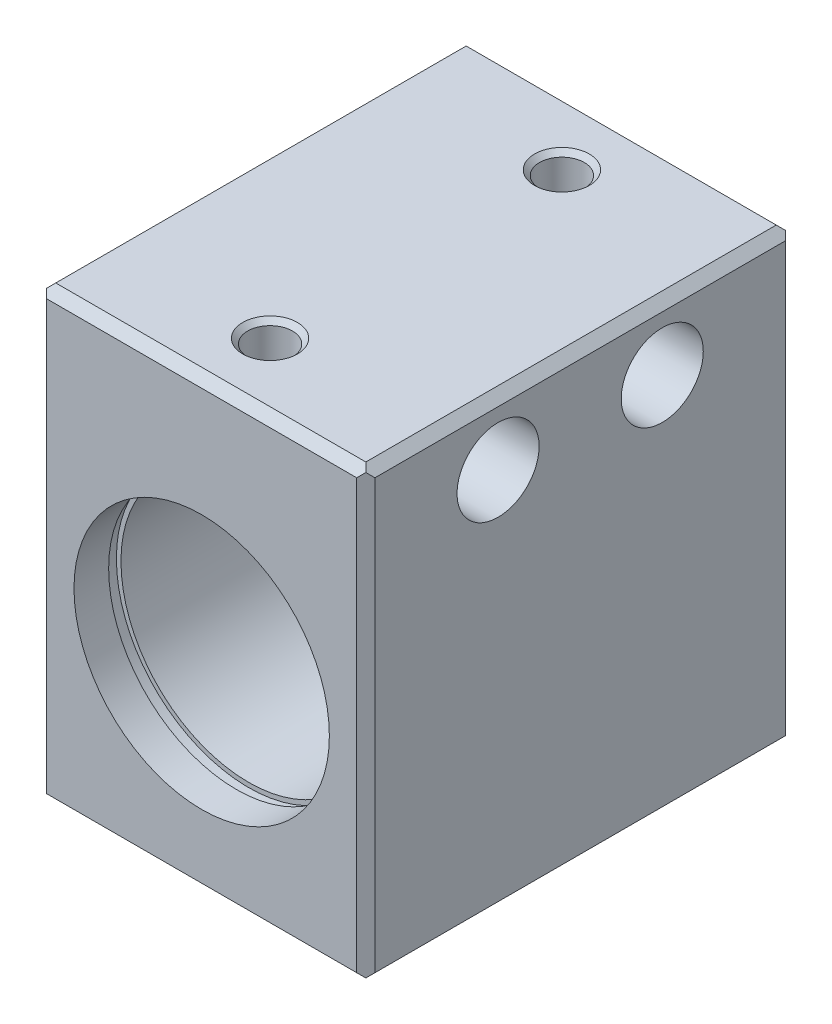
ISO-10303-21;
HEADER;
FILE_DESCRIPTION(('STEP AP214'),'2;1');
FILE_NAME('part.step','',(''),(''),'','','');
FILE_SCHEMA(('AUTOMOTIVE_DESIGN { 1 0 10303 214 1 1 1 1 }'));
ENDSEC;
DATA;
#1=APPLICATION_CONTEXT('core data for automotive mechanical design processes');
#2=APPLICATION_PROTOCOL_DEFINITION('international standard','automotive_design',2000,#1);
#3=PRODUCT_CONTEXT('',#1,'mechanical');
#4=PRODUCT('Part','Part','',(#3));
#5=PRODUCT_RELATED_PRODUCT_CATEGORY('part','',(#4));
#6=PRODUCT_DEFINITION_FORMATION('','',#4);
#7=PRODUCT_DEFINITION_CONTEXT('part definition',#1,'design');
#8=PRODUCT_DEFINITION('design','',#6,#7);
#9=PRODUCT_DEFINITION_SHAPE('','',#8);
#10=(LENGTH_UNIT() NAMED_UNIT(*) SI_UNIT(.MILLI.,.METRE.));
#11=(NAMED_UNIT(*) PLANE_ANGLE_UNIT() SI_UNIT($,.RADIAN.));
#12=(NAMED_UNIT(*) SI_UNIT($,.STERADIAN.) SOLID_ANGLE_UNIT());
#13=UNCERTAINTY_MEASURE_WITH_UNIT(LENGTH_MEASURE(1.E-05),#10,'distance_accuracy_value','');
#14=(GEOMETRIC_REPRESENTATION_CONTEXT(3) GLOBAL_UNCERTAINTY_ASSIGNED_CONTEXT((#13)) GLOBAL_UNIT_ASSIGNED_CONTEXT((#10,
#11,#12)) REPRESENTATION_CONTEXT('',''));
#15=CARTESIAN_POINT('',(0.,0.,0.));
#16=DIRECTION('',(0.,0.,1.));
#17=DIRECTION('',(1.,0.,0.));
#18=AXIS2_PLACEMENT_3D('',#15,#16,#17);
#19=CARTESIAN_POINT('',(0.,0.,0.));
#20=DIRECTION('',(0.,0.,-1.));
#21=DIRECTION('',(-1.,0.,0.));
#22=AXIS2_PLACEMENT_3D('',#19,#20,#21);
#23=CYLINDRICAL_SURFACE('',#22,14.);
#24=CARTESIAN_POINT('',(0.,0.,18.35));
#25=DIRECTION('',(0.,0.,-1.));
#26=DIRECTION('',(-1.,0.,0.));
#27=AXIS2_PLACEMENT_3D('',#24,#25,#26);
#28=CIRCLE('',#27,14.);
#29=CARTESIAN_POINT('',(-14.,0.,18.35));
#30=VERTEX_POINT('',#29);
#31=EDGE_CURVE('E20',#30,#30,#28,.F.);
#32=ORIENTED_EDGE('',*,*,#31,.T.);
#33=EDGE_LOOP('',(#32));
#34=FACE_BOUND('',#33,.T.);
#35=CARTESIAN_POINT('',(0.,0.,-18.35));
#36=DIRECTION('',(0.,0.,-1.));
#37=DIRECTION('',(-1.,0.,0.));
#38=AXIS2_PLACEMENT_3D('',#35,#36,#37);
#39=CIRCLE('',#38,14.);
#40=CARTESIAN_POINT('',(-14.,0.,-18.35));
#41=VERTEX_POINT('',#40);
#42=EDGE_CURVE('E395',#41,#41,#39,.T.);
#43=ORIENTED_EDGE('',*,*,#42,.T.);
#44=EDGE_LOOP('',(#43));
#45=FACE_BOUND('',#44,.T.);
#46=ADVANCED_FACE('F17',(#34,#45),#23,.F.);
#47=CARTESIAN_POINT('',(0.,14.25,18.35));
#48=DIRECTION('',(0.,0.,-1.));
#49=DIRECTION('',(-1.,0.,0.));
#50=AXIS2_PLACEMENT_3D('',#47,#48,#49);
#51=PLANE('',#50);
#52=ORIENTED_EDGE('',*,*,#31,.F.);
#53=EDGE_LOOP('',(#52));
#54=FACE_BOUND('',#53,.T.);
#55=CARTESIAN_POINT('',(0.,0.,18.35));
#56=DIRECTION('',(0.,0.,-1.));
#57=DIRECTION('',(-1.,0.,0.));
#58=AXIS2_PLACEMENT_3D('',#55,#56,#57);
#59=CIRCLE('',#58,14.5);
#60=CARTESIAN_POINT('',(-0.722303433468241,14.4819984031901,18.35));
#61=VERTEX_POINT('',#60);
#62=CARTESIAN_POINT('',(0.722303433468247,14.4819984031901,18.35));
#63=VERTEX_POINT('',#62);
#64=EDGE_CURVE('E155',#61,#63,#59,.F.);
#65=ORIENTED_EDGE('',*,*,#64,.T.);
#66=DIRECTION('',(0.,1.,0.));
#67=VECTOR('',#66,1.);
#68=CARTESIAN_POINT('',(0.722303433468244,14.25,18.35));
#69=LINE('',#68,#67);
#70=CARTESIAN_POINT('',(0.722303433468236,14.01,18.35));
#71=VERTEX_POINT('',#70);
#72=EDGE_CURVE('E162',#71,#63,#69,.T.);
#73=ORIENTED_EDGE('',*,*,#72,.F.);
#74=DIRECTION('',(1.,0.,0.));
#75=VECTOR('',#74,1.);
#76=CARTESIAN_POINT('',(0.,14.01,18.35));
#77=LINE('',#76,#75);
#78=CARTESIAN_POINT('',(-0.722303433468236,14.01,18.35));
#79=VERTEX_POINT('',#78);
#80=EDGE_CURVE('E158',#71,#79,#77,.F.);
#81=ORIENTED_EDGE('',*,*,#80,.T.);
#82=DIRECTION('',(0.,1.,0.));
#83=VECTOR('',#82,1.);
#84=CARTESIAN_POINT('',(-0.722303433468244,14.25,18.35));
#85=LINE('',#84,#83);
#86=EDGE_CURVE('E151',#61,#79,#85,.F.);
#87=ORIENTED_EDGE('',*,*,#86,.F.);
#88=EDGE_LOOP('',(#65,#73,#81,#87));
#89=FACE_BOUND('',#88,.T.);
#90=ADVANCED_FACE('F153',(#54,#89),#51,.F.);
#91=CARTESIAN_POINT('',(0.,14.25,-18.35));
#92=DIRECTION('',(0.,0.,1.));
#93=DIRECTION('',(1.,0.,0.));
#94=AXIS2_PLACEMENT_3D('',#91,#92,#93);
#95=PLANE('',#94);
#96=ORIENTED_EDGE('',*,*,#42,.F.);
#97=EDGE_LOOP('',(#96));
#98=FACE_BOUND('',#97,.T.);
#99=DIRECTION('',(1.,0.,0.));
#100=VECTOR('',#99,1.);
#101=CARTESIAN_POINT('',(0.,14.01,-18.35));
#102=LINE('',#101,#100);
#103=CARTESIAN_POINT('',(-0.722303433468236,14.01,-18.35));
#104=VERTEX_POINT('',#103);
#105=CARTESIAN_POINT('',(0.722303433468229,14.01,-18.35));
#106=VERTEX_POINT('',#105);
#107=EDGE_CURVE('E169',#104,#106,#102,.T.);
#108=ORIENTED_EDGE('',*,*,#107,.T.);
#109=DIRECTION('',(0.,1.,0.));
#110=VECTOR('',#109,1.);
#111=CARTESIAN_POINT('',(0.722303433468229,14.25,-18.35));
#112=LINE('',#111,#110);
#113=CARTESIAN_POINT('',(0.722303433468228,14.4819984031901,-18.35));
#114=VERTEX_POINT('',#113);
#115=EDGE_CURVE('E388',#114,#106,#112,.F.);
#116=ORIENTED_EDGE('',*,*,#115,.F.);
#117=CARTESIAN_POINT('',(0.,0.,-18.35));
#118=DIRECTION('',(0.,0.,-1.));
#119=DIRECTION('',(-1.,0.,0.));
#120=AXIS2_PLACEMENT_3D('',#117,#118,#119);
#121=CIRCLE('',#120,14.5);
#122=CARTESIAN_POINT('',(-0.722303433468254,14.4819984031901,-18.35));
#123=VERTEX_POINT('',#122);
#124=EDGE_CURVE('E168',#114,#123,#121,.T.);
#125=ORIENTED_EDGE('',*,*,#124,.T.);
#126=DIRECTION('',(0.,1.,0.));
#127=VECTOR('',#126,1.);
#128=CARTESIAN_POINT('',(-0.722303433468244,14.25,-18.35));
#129=LINE('',#128,#127);
#130=EDGE_CURVE('E391',#104,#123,#129,.T.);
#131=ORIENTED_EDGE('',*,*,#130,.F.);
#132=EDGE_LOOP('',(#108,#116,#125,#131));
#133=FACE_BOUND('',#132,.T.);
#134=ADVANCED_FACE('F393',(#98,#133),#95,.F.);
#135=CARTESIAN_POINT('',(0.,14.01,14.77075));
#136=DIRECTION('',(0.,-1.,0.));
#137=DIRECTION('',(0.,0.,-1.));
#138=AXIS2_PLACEMENT_3D('',#135,#136,#137);
#139=PLANE('',#138);
#140=ORIENTED_EDGE('',*,*,#80,.F.);
#141=CARTESIAN_POINT('',(0.,14.01,16.));
#142=DIRECTION('',(0.,-1.,0.));
#143=DIRECTION('',(0.,0.,-1.));
#144=AXIS2_PLACEMENT_3D('',#141,#142,#143);
#145=CIRCLE('',#144,2.4585);
#146=EDGE_CURVE('E173',#71,#79,#145,.F.);
#147=ORIENTED_EDGE('',*,*,#146,.T.);
#148=EDGE_LOOP('',(#140,#147));
#149=FACE_BOUND('',#148,.T.);
#150=ADVANCED_FACE('F613',(#149),#139,.F.);
#151=CARTESIAN_POINT('',(0.,14.01,-17.22925));
#152=DIRECTION('',(0.,-1.,0.));
#153=DIRECTION('',(0.,0.,-1.));
#154=AXIS2_PLACEMENT_3D('',#151,#152,#153);
#155=PLANE('',#154);
#156=CARTESIAN_POINT('',(0.,14.01,-16.));
#157=DIRECTION('',(0.,-1.,0.));
#158=DIRECTION('',(0.,0.,-1.));
#159=AXIS2_PLACEMENT_3D('',#156,#157,#158);
#160=CIRCLE('',#159,2.4585);
#161=EDGE_CURVE('E176',#104,#106,#160,.F.);
#162=ORIENTED_EDGE('',*,*,#161,.T.);
#163=ORIENTED_EDGE('',*,*,#107,.F.);
#164=EDGE_LOOP('',(#162,#163));
#165=FACE_BOUND('',#164,.T.);
#166=ADVANCED_FACE('F215',(#165),#155,.F.);
#167=CARTESIAN_POINT('',(0.,0.,19.025));
#168=DIRECTION('',(0.,0.,-1.));
#169=DIRECTION('',(-1.,0.,0.));
#170=AXIS2_PLACEMENT_3D('',#167,#168,#169);
#171=CYLINDRICAL_SURFACE('',#170,14.5);
#172=CARTESIAN_POINT('',(0.,0.,19.7));
#173=DIRECTION('',(0.,0.,-1.));
#174=DIRECTION('',(-1.,0.,0.));
#175=AXIS2_PLACEMENT_3D('',#172,#173,#174);
#176=CIRCLE('',#175,14.5);
#177=CARTESIAN_POINT('',(-14.5,0.,19.7));
#178=VERTEX_POINT('',#177);
#179=EDGE_CURVE('E347',#178,#178,#176,.F.);
#180=ORIENTED_EDGE('',*,*,#179,.T.);
#181=EDGE_LOOP('',(#180));
#182=FACE_BOUND('',#181,.T.);
#183=CARTESIAN_POINT('',(-0.72230343346824,14.4819984031901,18.35));
#184=CARTESIAN_POINT('',(-0.663277259254931,14.4849440582216,18.3681433250117));
#185=CARTESIAN_POINT('',(-0.603571473846199,14.4875581640115,18.3840588889899));
#186=CARTESIAN_POINT('',(-0.483107659711919,14.4920748298896,18.4113574079169));
#187=CARTESIAN_POINT('',(-0.422349654420086,14.4939774058028,18.4227404636727));
#188=CARTESIAN_POINT('',(-0.241763705776894,14.4984753583928,18.4495590074876));
#189=CARTESIAN_POINT('',(-0.120881852888447,14.5,18.4585));
#190=CARTESIAN_POINT('',(0.120881852888448,14.5,18.4585));
#191=CARTESIAN_POINT('',(0.241763705776897,14.4984753583928,18.4495590074876));
#192=CARTESIAN_POINT('',(0.422349654420091,14.4939774058028,18.4227404636727));
#193=CARTESIAN_POINT('',(0.483107659711924,14.4920748298896,18.4113574079169));
#194=CARTESIAN_POINT('',(0.603571473846205,14.4875581640115,18.3840588889899));
#195=CARTESIAN_POINT('',(0.663277259254938,14.4849440582216,18.3681433250117));
#196=CARTESIAN_POINT('',(0.722303433468248,14.4819984031901,18.35));
#197=B_SPLINE_CURVE_WITH_KNOTS('',3,(#183,#184,#185,#186,#187,#188,#189,#190,#191,#192,#193,
#194,#195,#196),.UNSPECIFIED.,.F.,.F.,(4,2,2,2,2,2,4),(0.,0.185379368417201,0.370754613594466,
0.732984293577592,1.09521397356072,1.28058921873799,1.46596858715519),.UNSPECIFIED.);
#198=EDGE_CURVE('E166',#61,#63,#197,.T.);
#199=ORIENTED_EDGE('',*,*,#198,.T.);
#200=ORIENTED_EDGE('',*,*,#64,.F.);
#201=EDGE_LOOP('',(#199,#200));
#202=FACE_BOUND('',#201,.T.);
#203=ADVANCED_FACE('F165',(#182,#202),#171,.F.);
#204=CARTESIAN_POINT('',(0.,0.,-19.025));
#205=DIRECTION('',(0.,0.,-1.));
#206=DIRECTION('',(-1.,0.,0.));
#207=AXIS2_PLACEMENT_3D('',#204,#205,#206);
#208=CYLINDRICAL_SURFACE('',#207,14.5);
#209=ORIENTED_EDGE('',*,*,#124,.F.);
#210=CARTESIAN_POINT('',(0.722303433468228,14.4819984031901,-18.35));
#211=CARTESIAN_POINT('',(0.663277259254919,14.4849440582216,-18.3681433250117));
#212=CARTESIAN_POINT('',(0.603571473846187,14.4875581640115,-18.3840588889899));
#213=CARTESIAN_POINT('',(0.48310765971191,14.4920748298896,-18.4113574079169));
#214=CARTESIAN_POINT('',(0.422349654420078,14.4939774058028,-18.4227404636727));
#215=CARTESIAN_POINT('',(0.24176370577689,14.4984753583928,-18.4495590074876));
#216=CARTESIAN_POINT('',(0.120881852888444,14.5,-18.4585));
#217=CARTESIAN_POINT('',(-0.12088185288845,14.5,-18.4585));
#218=CARTESIAN_POINT('',(-0.2417637057769,14.4984753583928,-18.4495590074876));
#219=CARTESIAN_POINT('',(-0.422349654420095,14.4939774058028,-18.4227404636727));
#220=CARTESIAN_POINT('',(-0.483107659711929,14.4920748298896,-18.4113574079169));
#221=CARTESIAN_POINT('',(-0.60357147384621,14.4875581640115,-18.3840588889899));
#222=CARTESIAN_POINT('',(-0.663277259254943,14.4849440582216,-18.3681433250117));
#223=CARTESIAN_POINT('',(-0.722303433468254,14.4819984031901,-18.35));
#224=B_SPLINE_CURVE_WITH_KNOTS('',3,(#210,#211,#212,#213,#214,#215,#216,#217,#218,#219,#220,
#221,#222,#223),.UNSPECIFIED.,.F.,.F.,(4,2,2,2,2,2,4),(0.,0.185379368417198,0.37075461359446,
0.732984293577581,1.09521397356071,1.28058921873798,1.46596858715519),.UNSPECIFIED.);
#225=EDGE_CURVE('E172',#114,#123,#224,.T.);
#226=ORIENTED_EDGE('',*,*,#225,.T.);
#227=EDGE_LOOP('',(#209,#226));
#228=FACE_BOUND('',#227,.T.);
#229=CARTESIAN_POINT('',(0.,0.,-19.7));
#230=DIRECTION('',(0.,0.,-1.));
#231=DIRECTION('',(-1.,0.,0.));
#232=AXIS2_PLACEMENT_3D('',#229,#230,#231);
#233=CIRCLE('',#232,14.5);
#234=CARTESIAN_POINT('',(-14.5,0.,-19.7));
#235=VERTEX_POINT('',#234);
#236=EDGE_CURVE('E377',#235,#235,#233,.T.);
#237=ORIENTED_EDGE('',*,*,#236,.T.);
#238=EDGE_LOOP('',(#237));
#239=FACE_BOUND('',#238,.T.);
#240=ADVANCED_FACE('F206',(#228,#239),#208,.F.);
#241=CARTESIAN_POINT('',(14.5,20.,-9.));
#242=DIRECTION('',(1.,0.,0.));
#243=DIRECTION('',(0.,0.,-1.));
#244=AXIS2_PLACEMENT_3D('',#241,#242,#243);
#245=CYLINDRICAL_SURFACE('',#244,4.5);
#246=CARTESIAN_POINT('',(11.,20.,-9.));
#247=DIRECTION('',(1.,0.,0.));
#248=DIRECTION('',(0.,0.,-1.));
#249=AXIS2_PLACEMENT_3D('',#246,#247,#248);
#250=CIRCLE('',#249,4.5);
#251=CARTESIAN_POINT('',(11.,20.,-13.5));
#252=VERTEX_POINT('',#251);
#253=EDGE_CURVE('E368',#252,#252,#250,.F.);
#254=ORIENTED_EDGE('',*,*,#253,.T.);
#255=EDGE_LOOP('',(#254));
#256=FACE_BOUND('',#255,.T.);
#257=CARTESIAN_POINT('',(18.,20.,-9.));
#258=DIRECTION('',(1.,0.,0.));
#259=DIRECTION('',(0.,0.,-1.));
#260=AXIS2_PLACEMENT_3D('',#257,#258,#259);
#261=CIRCLE('',#260,4.5);
#262=CARTESIAN_POINT('',(18.,20.,-13.5));
#263=VERTEX_POINT('',#262);
#264=EDGE_CURVE('E374',#263,#263,#261,.F.);
#265=ORIENTED_EDGE('',*,*,#264,.F.);
#266=EDGE_LOOP('',(#265));
#267=FACE_BOUND('',#266,.T.);
#268=ADVANCED_FACE('F203',(#256,#267),#245,.F.);
#269=CARTESIAN_POINT('',(14.5,20.,9.));
#270=DIRECTION('',(1.,0.,0.));
#271=DIRECTION('',(0.,0.,-1.));
#272=AXIS2_PLACEMENT_3D('',#269,#270,#271);
#273=CYLINDRICAL_SURFACE('',#272,4.5);
#274=CARTESIAN_POINT('',(11.,20.,9.));
#275=DIRECTION('',(1.,0.,0.));
#276=DIRECTION('',(0.,0.,-1.));
#277=AXIS2_PLACEMENT_3D('',#274,#275,#276);
#278=CIRCLE('',#277,4.5);
#279=CARTESIAN_POINT('',(11.,20.,4.5));
#280=VERTEX_POINT('',#279);
#281=EDGE_CURVE('E364',#280,#280,#278,.F.);
#282=ORIENTED_EDGE('',*,*,#281,.T.);
#283=EDGE_LOOP('',(#282));
#284=FACE_BOUND('',#283,.T.);
#285=CARTESIAN_POINT('',(18.,20.,9.));
#286=DIRECTION('',(1.,0.,0.));
#287=DIRECTION('',(0.,0.,-1.));
#288=AXIS2_PLACEMENT_3D('',#285,#286,#287);
#289=CIRCLE('',#288,4.5);
#290=CARTESIAN_POINT('',(18.,20.,4.5));
#291=VERTEX_POINT('',#290);
#292=EDGE_CURVE('E371',#291,#291,#289,.F.);
#293=ORIENTED_EDGE('',*,*,#292,.F.);
#294=EDGE_LOOP('',(#293));
#295=FACE_BOUND('',#294,.T.);
#296=ADVANCED_FACE('F197',(#284,#295),#273,.F.);
#297=CARTESIAN_POINT('',(0.,20.23425,16.));
#298=DIRECTION('',(0.,-1.,0.));
#299=DIRECTION('',(0.,0.,-1.));
#300=AXIS2_PLACEMENT_3D('',#297,#298,#299);
#301=CYLINDRICAL_SURFACE('',#300,2.4585);
#302=CARTESIAN_POINT('',(0.,26.4584999999897,16.));
#303=DIRECTION('',(0.,1.,0.));
#304=DIRECTION('',(0.,0.,-1.));
#305=AXIS2_PLACEMENT_3D('',#302,#303,#304);
#306=CIRCLE('',#305,2.45849999996926);
#307=CARTESIAN_POINT('',(0.,26.4584999999897,13.5415000000307));
#308=VERTEX_POINT('',#307);
#309=EDGE_CURVE('E398',#308,#308,#306,.T.);
#310=ORIENTED_EDGE('',*,*,#309,.T.);
#311=EDGE_LOOP('',(#310));
#312=FACE_BOUND('',#311,.T.);
#313=ORIENTED_EDGE('',*,*,#72,.T.);
#314=ORIENTED_EDGE('',*,*,#198,.F.);
#315=ORIENTED_EDGE('',*,*,#86,.T.);
#316=ORIENTED_EDGE('',*,*,#146,.F.);
#317=EDGE_LOOP('',(#313,#314,#315,#316));
#318=FACE_BOUND('',#317,.T.);
#319=ADVANCED_FACE('F171',(#312,#318),#301,.F.);
#320=CARTESIAN_POINT('',(0.,20.23425,-16.));
#321=DIRECTION('',(0.,-1.,0.));
#322=DIRECTION('',(0.,0.,-1.));
#323=AXIS2_PLACEMENT_3D('',#320,#321,#322);
#324=CYLINDRICAL_SURFACE('',#323,2.4585);
#325=CARTESIAN_POINT('',(0.,26.4584999999897,-16.));
#326=DIRECTION('',(0.,1.,0.));
#327=DIRECTION('',(0.,0.,-1.));
#328=AXIS2_PLACEMENT_3D('',#325,#326,#327);
#329=CIRCLE('',#328,2.45849999995153);
#330=CARTESIAN_POINT('',(0.,26.4584999999897,-18.4584999999515));
#331=VERTEX_POINT('',#330);
#332=EDGE_CURVE('E490',#331,#331,#329,.T.);
#333=ORIENTED_EDGE('',*,*,#332,.T.);
#334=EDGE_LOOP('',(#333));
#335=FACE_BOUND('',#334,.T.);
#336=ORIENTED_EDGE('',*,*,#115,.T.);
#337=ORIENTED_EDGE('',*,*,#161,.F.);
#338=ORIENTED_EDGE('',*,*,#130,.T.);
#339=ORIENTED_EDGE('',*,*,#225,.F.);
#340=EDGE_LOOP('',(#336,#337,#338,#339));
#341=FACE_BOUND('',#340,.T.);
#342=ADVANCED_FACE('F196',(#335,#341),#324,.F.);
#343=CARTESIAN_POINT('',(0.,14.25,19.7));
#344=DIRECTION('',(0.,0.,1.));
#345=DIRECTION('',(1.,0.,0.));
#346=AXIS2_PLACEMENT_3D('',#343,#344,#345);
#347=PLANE('',#346);
#348=ORIENTED_EDGE('',*,*,#179,.F.);
#349=EDGE_LOOP('',(#348));
#350=FACE_BOUND('',#349,.T.);
#351=CARTESIAN_POINT('',(0.,0.,19.7));
#352=DIRECTION('',(0.,0.,-1.));
#353=DIRECTION('',(-1.,0.,0.));
#354=AXIS2_PLACEMENT_3D('',#351,#352,#353);
#355=CIRCLE('',#354,14.);
#356=CARTESIAN_POINT('',(-14.,0.,19.7));
#357=VERTEX_POINT('',#356);
#358=EDGE_CURVE('E350',#357,#357,#355,.F.);
#359=ORIENTED_EDGE('',*,*,#358,.T.);
#360=EDGE_LOOP('',(#359));
#361=FACE_BOUND('',#360,.T.);
#362=ADVANCED_FACE('F336',(#350,#361),#347,.F.);
#363=CARTESIAN_POINT('',(0.,14.25,-19.7));
#364=DIRECTION('',(0.,0.,-1.));
#365=DIRECTION('',(-1.,0.,0.));
#366=AXIS2_PLACEMENT_3D('',#363,#364,#365);
#367=PLANE('',#366);
#368=CARTESIAN_POINT('',(0.,0.,-19.7));
#369=DIRECTION('',(0.,0.,-1.));
#370=DIRECTION('',(-1.,0.,0.));
#371=AXIS2_PLACEMENT_3D('',#368,#369,#370);
#372=CIRCLE('',#371,14.);
#373=CARTESIAN_POINT('',(-14.,0.,-19.7));
#374=VERTEX_POINT('',#373);
#375=EDGE_CURVE('E362',#374,#374,#372,.T.);
#376=ORIENTED_EDGE('',*,*,#375,.T.);
#377=EDGE_LOOP('',(#376));
#378=FACE_BOUND('',#377,.T.);
#379=ORIENTED_EDGE('',*,*,#236,.F.);
#380=EDGE_LOOP('',(#379));
#381=FACE_BOUND('',#380,.T.);
#382=ADVANCED_FACE('F333',(#378,#381),#367,.F.);
#383=CARTESIAN_POINT('',(18.,0.,0.));
#384=DIRECTION('',(1.,0.,0.));
#385=DIRECTION('',(0.,0.,-1.));
#386=AXIS2_PLACEMENT_3D('',#383,#384,#385);
#387=PLANE('',#386);
#388=ORIENTED_EDGE('',*,*,#292,.T.);
#389=EDGE_LOOP('',(#388));
#390=FACE_BOUND('',#389,.T.);
#391=ORIENTED_EDGE('',*,*,#264,.T.);
#392=EDGE_LOOP('',(#391));
#393=FACE_BOUND('',#392,.T.);
#394=DIRECTION('',(0.,1.,0.));
#395=VECTOR('',#394,1.);
#396=CARTESIAN_POINT('',(18.,49.,22.5));
#397=LINE('',#396,#395);
#398=CARTESIAN_POINT('',(18.,26.,22.5));
#399=VERTEX_POINT('',#398);
#400=CARTESIAN_POINT('',(18.,-21.,22.5));
#401=VERTEX_POINT('',#400);
#402=EDGE_CURVE('E488',#399,#401,#397,.F.);
#403=ORIENTED_EDGE('',*,*,#402,.T.);
#404=DIRECTION('',(0.,0.,1.));
#405=VECTOR('',#404,1.);
#406=CARTESIAN_POINT('',(18.,-21.,23.5));
#407=LINE('',#406,#405);
#408=CARTESIAN_POINT('',(18.,-21.,-22.5));
#409=VERTEX_POINT('',#408);
#410=EDGE_CURVE('E356',#401,#409,#407,.F.);
#411=ORIENTED_EDGE('',*,*,#410,.T.);
#412=DIRECTION('',(0.,1.,0.));
#413=VECTOR('',#412,1.);
#414=CARTESIAN_POINT('',(18.,49.,-22.5));
#415=LINE('',#414,#413);
#416=CARTESIAN_POINT('',(18.,26.,-22.5));
#417=VERTEX_POINT('',#416);
#418=EDGE_CURVE('E463',#409,#417,#415,.T.);
#419=ORIENTED_EDGE('',*,*,#418,.T.);
#420=DIRECTION('',(0.,0.,1.));
#421=VECTOR('',#420,1.);
#422=CARTESIAN_POINT('',(18.,26.,23.5));
#423=LINE('',#422,#421);
#424=EDGE_CURVE('E367',#417,#399,#423,.T.);
#425=ORIENTED_EDGE('',*,*,#424,.T.);
#426=EDGE_LOOP('',(#403,#411,#419,#425));
#427=FACE_BOUND('',#426,.T.);
#428=ADVANCED_FACE('F329',(#390,#393,#427),#387,.T.);
#429=CARTESIAN_POINT('',(11.,22.25,-9.));
#430=DIRECTION('',(-1.,0.,0.));
#431=DIRECTION('',(0.,0.,1.));
#432=AXIS2_PLACEMENT_3D('',#429,#430,#431);
#433=PLANE('',#432);
#434=ORIENTED_EDGE('',*,*,#253,.F.);
#435=EDGE_LOOP('',(#434));
#436=FACE_BOUND('',#435,.T.);
#437=CARTESIAN_POINT('',(10.9999999999673,20.,-9.));
#438=DIRECTION('',(1.,0.,0.));
#439=DIRECTION('',(0.,0.,-1.));
#440=AXIS2_PLACEMENT_3D('',#437,#438,#439);
#441=CIRCLE('',#440,2.99999999996771);
#442=CARTESIAN_POINT('',(10.9999999999673,20.,-11.9999999999677));
#443=VERTEX_POINT('',#442);
#444=EDGE_CURVE('E432',#443,#443,#441,.F.);
#445=ORIENTED_EDGE('',*,*,#444,.T.);
#446=EDGE_LOOP('',(#445));
#447=FACE_BOUND('',#446,.T.);
#448=ADVANCED_FACE('F325',(#436,#447),#433,.F.);
#449=CARTESIAN_POINT('',(11.,22.25,9.));
#450=DIRECTION('',(-1.,0.,0.));
#451=DIRECTION('',(0.,0.,1.));
#452=AXIS2_PLACEMENT_3D('',#449,#450,#451);
#453=PLANE('',#452);
#454=ORIENTED_EDGE('',*,*,#281,.F.);
#455=EDGE_LOOP('',(#454));
#456=FACE_BOUND('',#455,.T.);
#457=CARTESIAN_POINT('',(10.9999999999673,20.,9.));
#458=DIRECTION('',(1.,0.,0.));
#459=DIRECTION('',(0.,0.,-1.));
#460=AXIS2_PLACEMENT_3D('',#457,#458,#459);
#461=CIRCLE('',#460,2.99999999996771);
#462=CARTESIAN_POINT('',(10.9999999999673,20.,6.00000000003229));
#463=VERTEX_POINT('',#462);
#464=EDGE_CURVE('E429',#463,#463,#461,.F.);
#465=ORIENTED_EDGE('',*,*,#464,.T.);
#466=EDGE_LOOP('',(#465));
#467=FACE_BOUND('',#466,.T.);
#468=ADVANCED_FACE('F321',(#456,#467),#453,.F.);
#469=CARTESIAN_POINT('',(17.,27.,23.5));
#470=DIRECTION('',(-0.707106781186548,-0.707106781186548,0.));
#471=DIRECTION('',(0.707106781186548,-0.707106781186548,0.));
#472=AXIS2_PLACEMENT_3D('',#469,#470,#471);
#473=PLANE('',#472);
#474=DIRECTION('',(0.577350269189626,-0.577350269189626,-0.577350269189626));
#475=VECTOR('',#474,1.);
#476=CARTESIAN_POINT('',(17.,27.,-22.5));
#477=LINE('',#476,#475);
#478=CARTESIAN_POINT('',(17.,27.,-22.5));
#479=VERTEX_POINT('',#478);
#480=CARTESIAN_POINT('',(17.5,26.5,-23.));
#481=VERTEX_POINT('',#480);
#482=EDGE_CURVE('E434',#479,#481,#477,.T.);
#483=ORIENTED_EDGE('',*,*,#482,.F.);
#484=DIRECTION('',(0.,0.,1.));
#485=VECTOR('',#484,1.);
#486=CARTESIAN_POINT('',(17.,27.,-22.5));
#487=LINE('',#486,#485);
#488=CARTESIAN_POINT('',(17.,27.,22.5));
#489=VERTEX_POINT('',#488);
#490=EDGE_CURVE('E523',#489,#479,#487,.F.);
#491=ORIENTED_EDGE('',*,*,#490,.F.);
#492=DIRECTION('',(-0.577350269189626,0.577350269189626,-0.577350269189626));
#493=VECTOR('',#492,1.);
#494=CARTESIAN_POINT('',(17.5,26.5,23.));
#495=LINE('',#494,#493);
#496=CARTESIAN_POINT('',(17.5,26.5,23.));
#497=VERTEX_POINT('',#496);
#498=EDGE_CURVE('E480',#497,#489,#495,.T.);
#499=ORIENTED_EDGE('',*,*,#498,.F.);
#500=DIRECTION('',(0.577350269189627,-0.577350269189623,-0.577350269189627));
#501=VECTOR('',#500,1.);
#502=CARTESIAN_POINT('',(17.5,26.5,23.));
#503=LINE('',#502,#501);
#504=EDGE_CURVE('E485',#497,#399,#503,.T.);
#505=ORIENTED_EDGE('',*,*,#504,.T.);
#506=ORIENTED_EDGE('',*,*,#424,.F.);
#507=DIRECTION('',(-0.577350269189627,0.577350269189623,-0.577350269189627));
#508=VECTOR('',#507,1.);
#509=CARTESIAN_POINT('',(18.,26.,-22.5));
#510=LINE('',#509,#508);
#511=EDGE_CURVE('E461',#417,#481,#510,.T.);
#512=ORIENTED_EDGE('',*,*,#511,.T.);
#513=EDGE_LOOP('',(#483,#491,#499,#505,#506,#512));
#514=FACE_BOUND('',#513,.T.);
#515=ADVANCED_FACE('F317',(#514),#473,.F.);
#516=CARTESIAN_POINT('',(0.,27.0000000000437,16.));
#517=DIRECTION('',(0.,1.,0.));
#518=DIRECTION('',(0.,0.,1.));
#519=AXIS2_PLACEMENT_3D('',#516,#517,#518);
#520=CONICAL_SURFACE('',#519,3.00000000002319,0.785398163397448);
#521=CARTESIAN_POINT('',(0.,27.0000000000437,16.));
#522=DIRECTION('',(0.,1.,0.));
#523=DIRECTION('',(0.,0.,1.));
#524=AXIS2_PLACEMENT_3D('',#521,#522,#523);
#525=CIRCLE('',#524,3.00000000002319);
#526=CARTESIAN_POINT('',(0.,27.0000000000437,19.0000000000232));
#527=VERTEX_POINT('',#526);
#528=EDGE_CURVE('E425',#527,#527,#525,.F.);
#529=ORIENTED_EDGE('',*,*,#528,.F.);
#530=EDGE_LOOP('',(#529));
#531=FACE_BOUND('',#530,.T.);
#532=ORIENTED_EDGE('',*,*,#309,.F.);
#533=EDGE_LOOP('',(#532));
#534=FACE_BOUND('',#533,.T.);
#535=ADVANCED_FACE('F313',(#531,#534),#520,.F.);
#536=CARTESIAN_POINT('',(0.,27.0000000000437,-16.));
#537=DIRECTION('',(0.,1.,0.));
#538=DIRECTION('',(0.,0.,1.));
#539=AXIS2_PLACEMENT_3D('',#536,#537,#538);
#540=CONICAL_SURFACE('',#539,3.00000000000546,0.785398163397448);
#541=CARTESIAN_POINT('',(0.,27.0000000000437,-16.));
#542=DIRECTION('',(0.,1.,0.));
#543=DIRECTION('',(0.,0.,1.));
#544=AXIS2_PLACEMENT_3D('',#541,#542,#543);
#545=CIRCLE('',#544,3.00000000000546);
#546=CARTESIAN_POINT('',(0.,27.0000000000437,-12.9999999999945));
#547=VERTEX_POINT('',#546);
#548=EDGE_CURVE('E421',#547,#547,#545,.F.);
#549=ORIENTED_EDGE('',*,*,#548,.F.);
#550=EDGE_LOOP('',(#549));
#551=FACE_BOUND('',#550,.T.);
#552=ORIENTED_EDGE('',*,*,#332,.F.);
#553=EDGE_LOOP('',(#552));
#554=FACE_BOUND('',#553,.T.);
#555=ADVANCED_FACE('F309',(#551,#554),#540,.F.);
#556=CARTESIAN_POINT('',(18.,49.,22.5));
#557=DIRECTION('',(-0.707106781186548,0.,-0.707106781186548));
#558=DIRECTION('',(-0.707106781186548,0.,0.707106781186548));
#559=AXIS2_PLACEMENT_3D('',#556,#557,#558);
#560=PLANE('',#559);
#561=DIRECTION('',(0.577350269189626,0.577350269189626,-0.577350269189626));
#562=VECTOR('',#561,1.);
#563=CARTESIAN_POINT('',(17.,26.,23.5));
#564=LINE('',#563,#562);
#565=CARTESIAN_POINT('',(17.,26.,23.5));
#566=VERTEX_POINT('',#565);
#567=EDGE_CURVE('E482',#566,#497,#564,.T.);
#568=ORIENTED_EDGE('',*,*,#567,.F.);
#569=DIRECTION('',(0.,1.,0.));
#570=VECTOR('',#569,1.);
#571=CARTESIAN_POINT('',(17.,26.,23.5));
#572=LINE('',#571,#570);
#573=CARTESIAN_POINT('',(17.,-21.,23.5));
#574=VERTEX_POINT('',#573);
#575=EDGE_CURVE('E424',#574,#566,#572,.T.);
#576=ORIENTED_EDGE('',*,*,#575,.F.);
#577=DIRECTION('',(-0.577350269189626,0.577350269189626,0.577350269189626));
#578=VECTOR('',#577,1.);
#579=CARTESIAN_POINT('',(17.5,-21.5,23.));
#580=LINE('',#579,#578);
#581=CARTESIAN_POINT('',(17.5,-21.5,23.));
#582=VERTEX_POINT('',#581);
#583=EDGE_CURVE('E476',#582,#574,#580,.T.);
#584=ORIENTED_EDGE('',*,*,#583,.F.);
#585=DIRECTION('',(0.577350269189626,0.577350269189626,-0.577350269189626));
#586=VECTOR('',#585,1.);
#587=CARTESIAN_POINT('',(17.5,-21.5,23.));
#588=LINE('',#587,#586);
#589=EDGE_CURVE('E352',#582,#401,#588,.T.);
#590=ORIENTED_EDGE('',*,*,#589,.T.);
#591=ORIENTED_EDGE('',*,*,#402,.F.);
#592=ORIENTED_EDGE('',*,*,#504,.F.);
#593=EDGE_LOOP('',(#568,#576,#584,#590,#591,#592));
#594=FACE_BOUND('',#593,.T.);
#595=ADVANCED_FACE('F305',(#594),#560,.F.);
#596=CARTESIAN_POINT('',(18.,27.,22.5));
#597=DIRECTION('',(0.,0.707106781186548,0.707106781186548));
#598=DIRECTION('',(0.,-0.707106781186548,0.707106781186548));
#599=AXIS2_PLACEMENT_3D('',#596,#597,#598);
#600=PLANE('',#599);
#601=DIRECTION('',(0.577350269189626,-0.577350269189626,0.577350269189626));
#602=VECTOR('',#601,1.);
#603=CARTESIAN_POINT('',(-17.5,26.5,23.));
#604=LINE('',#603,#602);
#605=CARTESIAN_POINT('',(-17.5,26.5,23.));
#606=VERTEX_POINT('',#605);
#607=CARTESIAN_POINT('',(-17.,26.,23.5));
#608=VERTEX_POINT('',#607);
#609=EDGE_CURVE('E353',#606,#608,#604,.T.);
#610=ORIENTED_EDGE('',*,*,#609,.T.);
#611=DIRECTION('',(1.,0.,0.));
#612=VECTOR('',#611,1.);
#613=CARTESIAN_POINT('',(18.,26.,23.5));
#614=LINE('',#613,#612);
#615=EDGE_CURVE('E510',#566,#608,#614,.F.);
#616=ORIENTED_EDGE('',*,*,#615,.F.);
#617=ORIENTED_EDGE('',*,*,#567,.T.);
#618=ORIENTED_EDGE('',*,*,#498,.T.);
#619=DIRECTION('',(1.,0.,0.));
#620=VECTOR('',#619,1.);
#621=CARTESIAN_POINT('',(18.,27.,22.5));
#622=LINE('',#621,#620);
#623=CARTESIAN_POINT('',(-17.,27.,22.5));
#624=VERTEX_POINT('',#623);
#625=EDGE_CURVE('E431',#624,#489,#622,.T.);
#626=ORIENTED_EDGE('',*,*,#625,.F.);
#627=DIRECTION('',(-0.577350269189626,-0.577350269189626,0.577350269189626));
#628=VECTOR('',#627,1.);
#629=CARTESIAN_POINT('',(-17.,27.,22.5));
#630=LINE('',#629,#628);
#631=EDGE_CURVE('E358',#624,#606,#630,.T.);
#632=ORIENTED_EDGE('',*,*,#631,.T.);
#633=EDGE_LOOP('',(#610,#616,#617,#618,#626,#632));
#634=FACE_BOUND('',#633,.T.);
#635=ADVANCED_FACE('F301',(#634),#600,.T.);
#636=CARTESIAN_POINT('',(0.,0.,21.6));
#637=DIRECTION('',(0.,0.,-1.));
#638=DIRECTION('',(-1.,0.,0.));
#639=AXIS2_PLACEMENT_3D('',#636,#637,#638);
#640=CYLINDRICAL_SURFACE('',#639,14.);
#641=CARTESIAN_POINT('',(0.,0.,23.5));
#642=DIRECTION('',(0.,0.,-1.));
#643=DIRECTION('',(-1.,0.,0.));
#644=AXIS2_PLACEMENT_3D('',#641,#642,#643);
#645=CIRCLE('',#644,14.);
#646=CARTESIAN_POINT('',(-14.,0.,23.5));
#647=VERTEX_POINT('',#646);
#648=EDGE_CURVE('E416',#647,#647,#645,.T.);
#649=ORIENTED_EDGE('',*,*,#648,.F.);
#650=EDGE_LOOP('',(#649));
#651=FACE_BOUND('',#650,.T.);
#652=ORIENTED_EDGE('',*,*,#358,.F.);
#653=EDGE_LOOP('',(#652));
#654=FACE_BOUND('',#653,.T.);
#655=ADVANCED_FACE('F297',(#651,#654),#640,.F.);
#656=CARTESIAN_POINT('',(18.,-21.,23.5));
#657=DIRECTION('',(-0.707106781186548,0.707106781186548,0.));
#658=DIRECTION('',(-0.707106781186548,-0.707106781186548,0.));
#659=AXIS2_PLACEMENT_3D('',#656,#657,#658);
#660=PLANE('',#659);
#661=ORIENTED_EDGE('',*,*,#410,.F.);
#662=ORIENTED_EDGE('',*,*,#589,.F.);
#663=DIRECTION('',(0.577350269189626,0.577350269189626,0.577350269189626));
#664=VECTOR('',#663,1.);
#665=CARTESIAN_POINT('',(17.,-22.,22.5));
#666=LINE('',#665,#664);
#667=CARTESIAN_POINT('',(17.,-22.,22.5));
#668=VERTEX_POINT('',#667);
#669=EDGE_CURVE('E469',#668,#582,#666,.T.);
#670=ORIENTED_EDGE('',*,*,#669,.F.);
#671=DIRECTION('',(0.,0.,-1.));
#672=VECTOR('',#671,1.);
#673=CARTESIAN_POINT('',(17.,-22.,22.5));
#674=LINE('',#673,#672);
#675=CARTESIAN_POINT('',(17.,-22.,-22.5));
#676=VERTEX_POINT('',#675);
#677=EDGE_CURVE('E550',#676,#668,#674,.F.);
#678=ORIENTED_EDGE('',*,*,#677,.F.);
#679=DIRECTION('',(-0.577350269189626,-0.577350269189626,0.577350269189626));
#680=VECTOR('',#679,1.);
#681=CARTESIAN_POINT('',(17.5,-21.5,-23.));
#682=LINE('',#681,#680);
#683=CARTESIAN_POINT('',(17.5,-21.5,-23.));
#684=VERTEX_POINT('',#683);
#685=EDGE_CURVE('E456',#684,#676,#682,.T.);
#686=ORIENTED_EDGE('',*,*,#685,.F.);
#687=DIRECTION('',(0.577350269189626,0.577350269189626,0.577350269189626));
#688=VECTOR('',#687,1.);
#689=CARTESIAN_POINT('',(17.5,-21.5,-23.));
#690=LINE('',#689,#688);
#691=EDGE_CURVE('E466',#684,#409,#690,.T.);
#692=ORIENTED_EDGE('',*,*,#691,.T.);
#693=EDGE_LOOP('',(#661,#662,#670,#678,#686,#692));
#694=FACE_BOUND('',#693,.T.);
#695=ADVANCED_FACE('F293',(#694),#660,.F.);
#696=CARTESIAN_POINT('',(18.,-21.,23.5));
#697=DIRECTION('',(0.,-0.707106781186548,0.707106781186548));
#698=DIRECTION('',(0.,-0.707106781186548,-0.707106781186548));
#699=AXIS2_PLACEMENT_3D('',#696,#697,#698);
#700=PLANE('',#699);
#701=DIRECTION('',(1.,0.,0.));
#702=VECTOR('',#701,1.);
#703=CARTESIAN_POINT('',(18.,-22.,22.5));
#704=LINE('',#703,#702);
#705=CARTESIAN_POINT('',(-17.,-22.,22.5));
#706=VERTEX_POINT('',#705);
#707=EDGE_CURVE('E415',#668,#706,#704,.F.);
#708=ORIENTED_EDGE('',*,*,#707,.F.);
#709=ORIENTED_EDGE('',*,*,#669,.T.);
#710=ORIENTED_EDGE('',*,*,#583,.T.);
#711=DIRECTION('',(1.,0.,0.));
#712=VECTOR('',#711,1.);
#713=CARTESIAN_POINT('',(18.,-21.,23.5));
#714=LINE('',#713,#712);
#715=CARTESIAN_POINT('',(-17.,-21.,23.5));
#716=VERTEX_POINT('',#715);
#717=EDGE_CURVE('E420',#716,#574,#714,.T.);
#718=ORIENTED_EDGE('',*,*,#717,.F.);
#719=DIRECTION('',(-0.577350269189626,-0.577350269189626,-0.577350269189626));
#720=VECTOR('',#719,1.);
#721=CARTESIAN_POINT('',(-17.,-21.,23.5));
#722=LINE('',#721,#720);
#723=CARTESIAN_POINT('',(-17.5,-21.5,23.));
#724=VERTEX_POINT('',#723);
#725=EDGE_CURVE('E474',#716,#724,#722,.T.);
#726=ORIENTED_EDGE('',*,*,#725,.T.);
#727=DIRECTION('',(0.577350269189626,-0.577350269189626,-0.577350269189626));
#728=VECTOR('',#727,1.);
#729=CARTESIAN_POINT('',(-17.5,-21.5,23.));
#730=LINE('',#729,#728);
#731=EDGE_CURVE('E472',#724,#706,#730,.T.);
#732=ORIENTED_EDGE('',*,*,#731,.T.);
#733=EDGE_LOOP('',(#708,#709,#710,#718,#726,#732));
#734=FACE_BOUND('',#733,.T.);
#735=ADVANCED_FACE('F289',(#734),#700,.T.);
#736=CARTESIAN_POINT('',(0.,0.,-21.6));
#737=DIRECTION('',(0.,0.,-1.));
#738=DIRECTION('',(-1.,0.,0.));
#739=AXIS2_PLACEMENT_3D('',#736,#737,#738);
#740=CYLINDRICAL_SURFACE('',#739,14.);
#741=CARTESIAN_POINT('',(0.,0.,-23.5));
#742=DIRECTION('',(0.,0.,-1.));
#743=DIRECTION('',(-1.,0.,0.));
#744=AXIS2_PLACEMENT_3D('',#741,#742,#743);
#745=CIRCLE('',#744,14.);
#746=CARTESIAN_POINT('',(-14.,0.,-23.5));
#747=VERTEX_POINT('',#746);
#748=EDGE_CURVE('E411',#747,#747,#745,.F.);
#749=ORIENTED_EDGE('',*,*,#748,.F.);
#750=EDGE_LOOP('',(#749));
#751=FACE_BOUND('',#750,.T.);
#752=ORIENTED_EDGE('',*,*,#375,.F.);
#753=EDGE_LOOP('',(#752));
#754=FACE_BOUND('',#753,.T.);
#755=ADVANCED_FACE('F285',(#751,#754),#740,.F.);
#756=CARTESIAN_POINT('',(17.,49.,-23.5));
#757=DIRECTION('',(-0.707106781186548,0.,0.707106781186548));
#758=DIRECTION('',(0.707106781186548,0.,0.707106781186548));
#759=AXIS2_PLACEMENT_3D('',#756,#757,#758);
#760=PLANE('',#759);
#761=ORIENTED_EDGE('',*,*,#418,.F.);
#762=ORIENTED_EDGE('',*,*,#691,.F.);
#763=DIRECTION('',(0.577350269189626,-0.577350269189626,0.577350269189626));
#764=VECTOR('',#763,1.);
#765=CARTESIAN_POINT('',(17.,-21.,-23.5));
#766=LINE('',#765,#764);
#767=CARTESIAN_POINT('',(17.,-21.,-23.5));
#768=VERTEX_POINT('',#767);
#769=EDGE_CURVE('E458',#768,#684,#766,.T.);
#770=ORIENTED_EDGE('',*,*,#769,.F.);
#771=DIRECTION('',(0.,1.,0.));
#772=VECTOR('',#771,1.);
#773=CARTESIAN_POINT('',(17.,-21.,-23.5));
#774=LINE('',#773,#772);
#775=CARTESIAN_POINT('',(17.,26.,-23.5));
#776=VERTEX_POINT('',#775);
#777=EDGE_CURVE('E414',#776,#768,#774,.F.);
#778=ORIENTED_EDGE('',*,*,#777,.F.);
#779=DIRECTION('',(-0.577350269189626,-0.577350269189626,-0.577350269189626));
#780=VECTOR('',#779,1.);
#781=CARTESIAN_POINT('',(17.5,26.5,-23.));
#782=LINE('',#781,#780);
#783=EDGE_CURVE('E450',#481,#776,#782,.T.);
#784=ORIENTED_EDGE('',*,*,#783,.F.);
#785=ORIENTED_EDGE('',*,*,#511,.F.);
#786=EDGE_LOOP('',(#761,#762,#770,#778,#784,#785));
#787=FACE_BOUND('',#786,.T.);
#788=ADVANCED_FACE('F281',(#787),#760,.F.);
#789=CARTESIAN_POINT('',(18.,-22.,-22.5));
#790=DIRECTION('',(0.,-0.707106781186548,-0.707106781186548));
#791=DIRECTION('',(0.,0.707106781186548,-0.707106781186548));
#792=AXIS2_PLACEMENT_3D('',#789,#790,#791);
#793=PLANE('',#792);
#794=DIRECTION('',(0.577350269189626,0.577350269189626,-0.577350269189626));
#795=VECTOR('',#794,1.);
#796=CARTESIAN_POINT('',(-17.5,-21.5,-23.));
#797=LINE('',#796,#795);
#798=CARTESIAN_POINT('',(-17.5,-21.5,-23.));
#799=VERTEX_POINT('',#798);
#800=CARTESIAN_POINT('',(-17.,-21.,-23.5));
#801=VERTEX_POINT('',#800);
#802=EDGE_CURVE('E452',#799,#801,#797,.T.);
#803=ORIENTED_EDGE('',*,*,#802,.T.);
#804=DIRECTION('',(-1.,0.,0.));
#805=VECTOR('',#804,1.);
#806=CARTESIAN_POINT('',(18.,-21.,-23.5));
#807=LINE('',#806,#805);
#808=EDGE_CURVE('E538',#768,#801,#807,.T.);
#809=ORIENTED_EDGE('',*,*,#808,.F.);
#810=ORIENTED_EDGE('',*,*,#769,.T.);
#811=ORIENTED_EDGE('',*,*,#685,.T.);
#812=DIRECTION('',(1.,0.,0.));
#813=VECTOR('',#812,1.);
#814=CARTESIAN_POINT('',(18.,-22.,-22.5));
#815=LINE('',#814,#813);
#816=CARTESIAN_POINT('',(-17.,-22.,-22.5));
#817=VERTEX_POINT('',#816);
#818=EDGE_CURVE('E419',#817,#676,#815,.T.);
#819=ORIENTED_EDGE('',*,*,#818,.F.);
#820=DIRECTION('',(-0.577350269189626,0.577350269189626,-0.577350269189626));
#821=VECTOR('',#820,1.);
#822=CARTESIAN_POINT('',(-17.,-22.,-22.5));
#823=LINE('',#822,#821);
#824=EDGE_CURVE('E454',#817,#799,#823,.T.);
#825=ORIENTED_EDGE('',*,*,#824,.T.);
#826=EDGE_LOOP('',(#803,#809,#810,#811,#819,#825));
#827=FACE_BOUND('',#826,.T.);
#828=ADVANCED_FACE('F277',(#827),#793,.T.);
#829=CARTESIAN_POINT('',(18.,26.,-23.5));
#830=DIRECTION('',(0.,0.707106781186548,-0.707106781186548));
#831=DIRECTION('',(0.,0.707106781186548,0.707106781186548));
#832=AXIS2_PLACEMENT_3D('',#829,#830,#831);
#833=PLANE('',#832);
#834=DIRECTION('',(1.,0.,0.));
#835=VECTOR('',#834,1.);
#836=CARTESIAN_POINT('',(18.,27.,-22.5));
#837=LINE('',#836,#835);
#838=CARTESIAN_POINT('',(-17.,27.,-22.5));
#839=VERTEX_POINT('',#838);
#840=EDGE_CURVE('E428',#479,#839,#837,.F.);
#841=ORIENTED_EDGE('',*,*,#840,.F.);
#842=ORIENTED_EDGE('',*,*,#482,.T.);
#843=ORIENTED_EDGE('',*,*,#783,.T.);
#844=DIRECTION('',(-1.,0.,0.));
#845=VECTOR('',#844,1.);
#846=CARTESIAN_POINT('',(18.,26.,-23.5));
#847=LINE('',#846,#845);
#848=CARTESIAN_POINT('',(-17.,26.,-23.5));
#849=VERTEX_POINT('',#848);
#850=EDGE_CURVE('E534',#849,#776,#847,.F.);
#851=ORIENTED_EDGE('',*,*,#850,.F.);
#852=DIRECTION('',(-0.577350269189626,0.577350269189626,0.577350269189626));
#853=VECTOR('',#852,1.);
#854=CARTESIAN_POINT('',(-17.,26.,-23.5));
#855=LINE('',#854,#853);
#856=CARTESIAN_POINT('',(-17.5,26.5,-23.));
#857=VERTEX_POINT('',#856);
#858=EDGE_CURVE('E443',#849,#857,#855,.T.);
#859=ORIENTED_EDGE('',*,*,#858,.T.);
#860=DIRECTION('',(0.577350269189626,0.577350269189626,0.577350269189626));
#861=VECTOR('',#860,1.);
#862=CARTESIAN_POINT('',(-17.5,26.5,-23.));
#863=LINE('',#862,#861);
#864=EDGE_CURVE('E438',#857,#839,#863,.T.);
#865=ORIENTED_EDGE('',*,*,#864,.T.);
#866=EDGE_LOOP('',(#841,#842,#843,#851,#859,#865));
#867=FACE_BOUND('',#866,.T.);
#868=ADVANCED_FACE('F273',(#867),#833,.T.);
#869=CARTESIAN_POINT('',(10.9999999999104,20.,-9.));
#870=DIRECTION('',(1.,0.,0.));
#871=DIRECTION('',(0.,0.,-1.));
#872=AXIS2_PLACEMENT_3D('',#869,#870,#871);
#873=CONICAL_SURFACE('',#872,2.99999999991087,0.785398163397448);
#874=ORIENTED_EDGE('',*,*,#444,.F.);
#875=EDGE_LOOP('',(#874));
#876=FACE_BOUND('',#875,.T.);
#877=CARTESIAN_POINT('',(10.4585,20.,-9.));
#878=DIRECTION('',(1.,0.,0.));
#879=DIRECTION('',(0.,0.,-1.));
#880=AXIS2_PLACEMENT_3D('',#877,#878,#879);
#881=CIRCLE('',#880,2.4585);
#882=CARTESIAN_POINT('',(10.4585,20.,-11.4585));
#883=VERTEX_POINT('',#882);
#884=EDGE_CURVE('E446',#883,#883,#881,.F.);
#885=ORIENTED_EDGE('',*,*,#884,.T.);
#886=EDGE_LOOP('',(#885));
#887=FACE_BOUND('',#886,.T.);
#888=ADVANCED_FACE('F269',(#876,#887),#873,.F.);
#889=CARTESIAN_POINT('',(10.9999999999104,20.,9.));
#890=DIRECTION('',(1.,0.,0.));
#891=DIRECTION('',(0.,0.,-1.));
#892=AXIS2_PLACEMENT_3D('',#889,#890,#891);
#893=CONICAL_SURFACE('',#892,2.99999999991087,0.785398163397448);
#894=ORIENTED_EDGE('',*,*,#464,.F.);
#895=EDGE_LOOP('',(#894));
#896=FACE_BOUND('',#895,.T.);
#897=CARTESIAN_POINT('',(10.4585,20.,9.));
#898=DIRECTION('',(1.,0.,0.));
#899=DIRECTION('',(0.,0.,-1.));
#900=AXIS2_PLACEMENT_3D('',#897,#898,#899);
#901=CIRCLE('',#900,2.4585);
#902=CARTESIAN_POINT('',(10.4585,20.,6.5415));
#903=VERTEX_POINT('',#902);
#904=EDGE_CURVE('E525',#903,#903,#901,.F.);
#905=ORIENTED_EDGE('',*,*,#904,.T.);
#906=EDGE_LOOP('',(#905));
#907=FACE_BOUND('',#906,.T.);
#908=ADVANCED_FACE('F265',(#896,#907),#893,.F.);
#909=CARTESIAN_POINT('',(18.,27.,-22.5));
#910=DIRECTION('',(0.,1.,0.));
#911=DIRECTION('',(0.,0.,1.));
#912=AXIS2_PLACEMENT_3D('',#909,#910,#911);
#913=PLANE('',#912);
#914=ORIENTED_EDGE('',*,*,#548,.T.);
#915=EDGE_LOOP('',(#914));
#916=FACE_BOUND('',#915,.T.);
#917=ORIENTED_EDGE('',*,*,#528,.T.);
#918=EDGE_LOOP('',(#917));
#919=FACE_BOUND('',#918,.T.);
#920=ORIENTED_EDGE('',*,*,#490,.T.);
#921=ORIENTED_EDGE('',*,*,#840,.T.);
#922=DIRECTION('',(0.,0.,1.));
#923=VECTOR('',#922,1.);
#924=CARTESIAN_POINT('',(-17.,27.,23.5));
#925=LINE('',#924,#923);
#926=EDGE_CURVE('E527',#839,#624,#925,.T.);
#927=ORIENTED_EDGE('',*,*,#926,.T.);
#928=ORIENTED_EDGE('',*,*,#625,.T.);
#929=EDGE_LOOP('',(#920,#921,#927,#928));
#930=FACE_BOUND('',#929,.T.);
#931=ADVANCED_FACE('F261',(#916,#919,#930),#913,.T.);
#932=CARTESIAN_POINT('',(18.,26.,23.5));
#933=DIRECTION('',(0.,0.,1.));
#934=DIRECTION('',(1.,0.,0.));
#935=AXIS2_PLACEMENT_3D('',#932,#933,#934);
#936=PLANE('',#935);
#937=ORIENTED_EDGE('',*,*,#648,.T.);
#938=EDGE_LOOP('',(#937));
#939=FACE_BOUND('',#938,.T.);
#940=DIRECTION('',(0.,1.,0.));
#941=VECTOR('',#940,1.);
#942=CARTESIAN_POINT('',(-17.,49.,23.5));
#943=LINE('',#942,#941);
#944=EDGE_CURVE('E531',#608,#716,#943,.F.);
#945=ORIENTED_EDGE('',*,*,#944,.T.);
#946=ORIENTED_EDGE('',*,*,#717,.T.);
#947=ORIENTED_EDGE('',*,*,#575,.T.);
#948=ORIENTED_EDGE('',*,*,#615,.T.);
#949=EDGE_LOOP('',(#945,#946,#947,#948));
#950=FACE_BOUND('',#949,.T.);
#951=ADVANCED_FACE('F257',(#939,#950),#936,.T.);
#952=CARTESIAN_POINT('',(18.,-22.,22.5));
#953=DIRECTION('',(0.,-1.,0.));
#954=DIRECTION('',(0.,0.,-1.));
#955=AXIS2_PLACEMENT_3D('',#952,#953,#954);
#956=PLANE('',#955);
#957=ORIENTED_EDGE('',*,*,#677,.T.);
#958=ORIENTED_EDGE('',*,*,#707,.T.);
#959=DIRECTION('',(0.,0.,1.));
#960=VECTOR('',#959,1.);
#961=CARTESIAN_POINT('',(-17.,-22.,23.5));
#962=LINE('',#961,#960);
#963=EDGE_CURVE('E557',#706,#817,#962,.F.);
#964=ORIENTED_EDGE('',*,*,#963,.T.);
#965=ORIENTED_EDGE('',*,*,#818,.T.);
#966=EDGE_LOOP('',(#957,#958,#964,#965));
#967=FACE_BOUND('',#966,.T.);
#968=ADVANCED_FACE('F253',(#967),#956,.T.);
#969=CARTESIAN_POINT('',(18.,-21.,-23.5));
#970=DIRECTION('',(0.,0.,-1.));
#971=DIRECTION('',(-1.,0.,0.));
#972=AXIS2_PLACEMENT_3D('',#969,#970,#971);
#973=PLANE('',#972);
#974=DIRECTION('',(0.,1.,0.));
#975=VECTOR('',#974,1.);
#976=CARTESIAN_POINT('',(-17.,49.,-23.5));
#977=LINE('',#976,#975);
#978=EDGE_CURVE('E410',#801,#849,#977,.T.);
#979=ORIENTED_EDGE('',*,*,#978,.T.);
#980=ORIENTED_EDGE('',*,*,#850,.T.);
#981=ORIENTED_EDGE('',*,*,#777,.T.);
#982=ORIENTED_EDGE('',*,*,#808,.T.);
#983=EDGE_LOOP('',(#979,#980,#981,#982));
#984=FACE_BOUND('',#983,.T.);
#985=ORIENTED_EDGE('',*,*,#748,.T.);
#986=EDGE_LOOP('',(#985));
#987=FACE_BOUND('',#986,.T.);
#988=ADVANCED_FACE('F249',(#984,#987),#973,.T.);
#989=CARTESIAN_POINT('',(-3.77075,20.,-9.));
#990=DIRECTION('',(1.,0.,0.));
#991=DIRECTION('',(0.,0.,-1.));
#992=AXIS2_PLACEMENT_3D('',#989,#990,#991);
#993=CYLINDRICAL_SURFACE('',#992,2.4585);
#994=ORIENTED_EDGE('',*,*,#884,.F.);
#995=EDGE_LOOP('',(#994));
#996=FACE_BOUND('',#995,.T.);
#997=CARTESIAN_POINT('',(-18.,20.,-9.));
#998=DIRECTION('',(1.,0.,0.));
#999=DIRECTION('',(0.,0.,-1.));
#1000=AXIS2_PLACEMENT_3D('',#997,#998,#999);
#1001=CIRCLE('',#1000,2.4585);
#1002=CARTESIAN_POINT('',(-18.,20.,-11.4585));
#1003=VERTEX_POINT('',#1002);
#1004=EDGE_CURVE('E407',#1003,#1003,#1001,.F.);
#1005=ORIENTED_EDGE('',*,*,#1004,.T.);
#1006=EDGE_LOOP('',(#1005));
#1007=FACE_BOUND('',#1006,.T.);
#1008=ADVANCED_FACE('F245',(#996,#1007),#993,.F.);
#1009=CARTESIAN_POINT('',(-3.77075,20.,9.));
#1010=DIRECTION('',(1.,0.,0.));
#1011=DIRECTION('',(0.,0.,-1.));
#1012=AXIS2_PLACEMENT_3D('',#1009,#1010,#1011);
#1013=CYLINDRICAL_SURFACE('',#1012,2.4585);
#1014=ORIENTED_EDGE('',*,*,#904,.F.);
#1015=EDGE_LOOP('',(#1014));
#1016=FACE_BOUND('',#1015,.T.);
#1017=CARTESIAN_POINT('',(-18.,20.,9.));
#1018=DIRECTION('',(1.,0.,0.));
#1019=DIRECTION('',(0.,0.,-1.));
#1020=AXIS2_PLACEMENT_3D('',#1017,#1018,#1019);
#1021=CIRCLE('',#1020,2.4585);
#1022=CARTESIAN_POINT('',(-18.,20.,6.5415));
#1023=VERTEX_POINT('',#1022);
#1024=EDGE_CURVE('E403',#1023,#1023,#1021,.F.);
#1025=ORIENTED_EDGE('',*,*,#1024,.T.);
#1026=EDGE_LOOP('',(#1025));
#1027=FACE_BOUND('',#1026,.T.);
#1028=ADVANCED_FACE('F241',(#1016,#1027),#1013,.F.);
#1029=CARTESIAN_POINT('',(-18.,26.,23.5));
#1030=DIRECTION('',(0.707106781186548,-0.707106781186548,0.));
#1031=DIRECTION('',(0.707106781186548,0.707106781186548,0.));
#1032=AXIS2_PLACEMENT_3D('',#1029,#1030,#1031);
#1033=PLANE('',#1032);
#1034=DIRECTION('',(0.,0.,-1.));
#1035=VECTOR('',#1034,1.);
#1036=CARTESIAN_POINT('',(-18.,26.,0.));
#1037=LINE('',#1036,#1035);
#1038=CARTESIAN_POINT('',(-18.,26.,-22.5));
#1039=VERTEX_POINT('',#1038);
#1040=CARTESIAN_POINT('',(-18.,26.,22.5));
#1041=VERTEX_POINT('',#1040);
#1042=EDGE_CURVE('E406',#1039,#1041,#1037,.F.);
#1043=ORIENTED_EDGE('',*,*,#1042,.T.);
#1044=DIRECTION('',(0.577350269189627,0.577350269189623,0.577350269189627));
#1045=VECTOR('',#1044,1.);
#1046=CARTESIAN_POINT('',(-18.,26.,22.5));
#1047=LINE('',#1046,#1045);
#1048=EDGE_CURVE('E568',#1041,#606,#1047,.T.);
#1049=ORIENTED_EDGE('',*,*,#1048,.T.);
#1050=ORIENTED_EDGE('',*,*,#631,.F.);
#1051=ORIENTED_EDGE('',*,*,#926,.F.);
#1052=ORIENTED_EDGE('',*,*,#864,.F.);
#1053=DIRECTION('',(-0.577350269189627,-0.577350269189623,0.577350269189627));
#1054=VECTOR('',#1053,1.);
#1055=CARTESIAN_POINT('',(-17.5,26.5,-23.));
#1056=LINE('',#1055,#1054);
#1057=EDGE_CURVE('E562',#857,#1039,#1056,.T.);
#1058=ORIENTED_EDGE('',*,*,#1057,.T.);
#1059=EDGE_LOOP('',(#1043,#1049,#1050,#1051,#1052,#1058));
#1060=FACE_BOUND('',#1059,.T.);
#1061=ADVANCED_FACE('F237',(#1060),#1033,.F.);
#1062=CARTESIAN_POINT('',(-17.,49.,23.5));
#1063=DIRECTION('',(0.707106781186548,0.,-0.707106781186548));
#1064=DIRECTION('',(-0.707106781186548,0.,-0.707106781186548));
#1065=AXIS2_PLACEMENT_3D('',#1062,#1063,#1064);
#1066=PLANE('',#1065);
#1067=ORIENTED_EDGE('',*,*,#1048,.F.);
#1068=DIRECTION('',(0.,1.,0.));
#1069=VECTOR('',#1068,1.);
#1070=CARTESIAN_POINT('',(-18.,0.,22.5));
#1071=LINE('',#1070,#1069);
#1072=CARTESIAN_POINT('',(-18.,-21.,22.5));
#1073=VERTEX_POINT('',#1072);
#1074=EDGE_CURVE('E576',#1041,#1073,#1071,.F.);
#1075=ORIENTED_EDGE('',*,*,#1074,.T.);
#1076=DIRECTION('',(0.577350269189626,-0.577350269189626,0.577350269189626));
#1077=VECTOR('',#1076,1.);
#1078=CARTESIAN_POINT('',(-18.,-21.,22.5));
#1079=LINE('',#1078,#1077);
#1080=EDGE_CURVE('E563',#1073,#724,#1079,.T.);
#1081=ORIENTED_EDGE('',*,*,#1080,.T.);
#1082=ORIENTED_EDGE('',*,*,#725,.F.);
#1083=ORIENTED_EDGE('',*,*,#944,.F.);
#1084=ORIENTED_EDGE('',*,*,#609,.F.);
#1085=EDGE_LOOP('',(#1067,#1075,#1081,#1082,#1083,#1084));
#1086=FACE_BOUND('',#1085,.T.);
#1087=ADVANCED_FACE('F233',(#1086),#1066,.F.);
#1088=CARTESIAN_POINT('',(-17.,-22.,23.5));
#1089=DIRECTION('',(0.707106781186548,0.707106781186548,0.));
#1090=DIRECTION('',(-0.707106781186548,0.707106781186548,0.));
#1091=AXIS2_PLACEMENT_3D('',#1088,#1089,#1090);
#1092=PLANE('',#1091);
#1093=ORIENTED_EDGE('',*,*,#824,.F.);
#1094=ORIENTED_EDGE('',*,*,#963,.F.);
#1095=ORIENTED_EDGE('',*,*,#731,.F.);
#1096=ORIENTED_EDGE('',*,*,#1080,.F.);
#1097=DIRECTION('',(0.,0.,-1.));
#1098=VECTOR('',#1097,1.);
#1099=CARTESIAN_POINT('',(-18.,-21.,0.));
#1100=LINE('',#1099,#1098);
#1101=CARTESIAN_POINT('',(-18.,-21.,-22.5));
#1102=VERTEX_POINT('',#1101);
#1103=EDGE_CURVE('E26',#1073,#1102,#1100,.T.);
#1104=ORIENTED_EDGE('',*,*,#1103,.T.);
#1105=DIRECTION('',(0.577350269189626,-0.577350269189626,-0.577350269189626));
#1106=VECTOR('',#1105,1.);
#1107=CARTESIAN_POINT('',(-18.,-21.,-22.5));
#1108=LINE('',#1107,#1106);
#1109=EDGE_CURVE('E34',#1102,#799,#1108,.T.);
#1110=ORIENTED_EDGE('',*,*,#1109,.T.);
#1111=EDGE_LOOP('',(#1093,#1094,#1095,#1096,#1104,#1110));
#1112=FACE_BOUND('',#1111,.T.);
#1113=ADVANCED_FACE('F226',(#1112),#1092,.F.);
#1114=CARTESIAN_POINT('',(-18.,49.,-22.5));
#1115=DIRECTION('',(0.707106781186548,0.,0.707106781186548));
#1116=DIRECTION('',(0.707106781186548,0.,-0.707106781186548));
#1117=AXIS2_PLACEMENT_3D('',#1114,#1115,#1116);
#1118=PLANE('',#1117);
#1119=ORIENTED_EDGE('',*,*,#978,.F.);
#1120=ORIENTED_EDGE('',*,*,#802,.F.);
#1121=ORIENTED_EDGE('',*,*,#1109,.F.);
#1122=DIRECTION('',(0.,1.,0.));
#1123=VECTOR('',#1122,1.);
#1124=CARTESIAN_POINT('',(-18.,0.,-22.5));
#1125=LINE('',#1124,#1123);
#1126=EDGE_CURVE('E11',#1102,#1039,#1125,.T.);
#1127=ORIENTED_EDGE('',*,*,#1126,.T.);
#1128=ORIENTED_EDGE('',*,*,#1057,.F.);
#1129=ORIENTED_EDGE('',*,*,#858,.F.);
#1130=EDGE_LOOP('',(#1119,#1120,#1121,#1127,#1128,#1129));
#1131=FACE_BOUND('',#1130,.T.);
#1132=ADVANCED_FACE('F220',(#1131),#1118,.F.);
#1133=CARTESIAN_POINT('',(-18.,0.,0.));
#1134=DIRECTION('',(1.,0.,0.));
#1135=DIRECTION('',(0.,0.,-1.));
#1136=AXIS2_PLACEMENT_3D('',#1133,#1134,#1135);
#1137=PLANE('',#1136);
#1138=ORIENTED_EDGE('',*,*,#1103,.F.);
#1139=ORIENTED_EDGE('',*,*,#1074,.F.);
#1140=ORIENTED_EDGE('',*,*,#1042,.F.);
#1141=ORIENTED_EDGE('',*,*,#1126,.F.);
#1142=EDGE_LOOP('',(#1138,#1139,#1140,#1141));
#1143=FACE_BOUND('',#1142,.T.);
#1144=ORIENTED_EDGE('',*,*,#1024,.F.);
#1145=EDGE_LOOP('',(#1144));
#1146=FACE_BOUND('',#1145,.T.);
#1147=ORIENTED_EDGE('',*,*,#1004,.F.);
#1148=EDGE_LOOP('',(#1147));
#1149=FACE_BOUND('',#1148,.T.);
#1150=ADVANCED_FACE('F218',(#1143,#1146,#1149),#1137,.F.);
#1151=CLOSED_SHELL('',(#46,#90,#134,#150,#166,#203,#240,#268,#296,#319,#342,#362,#382,#428,#448,
#468,#515,#535,#555,#595,#635,#655,#695,#735,#755,#788,#828,#868,#888,#908,#931,#951,#968,#988,
#1008,#1028,#1061,#1087,#1113,#1132,#1150));
#1152=MANIFOLD_SOLID_BREP('B1',#1151);
#1153=ADVANCED_BREP_SHAPE_REPRESENTATION('',(#18,#1152),#14);
#1154=SHAPE_DEFINITION_REPRESENTATION(#9,#1153);
ENDSEC;
END-ISO-10303-21;
